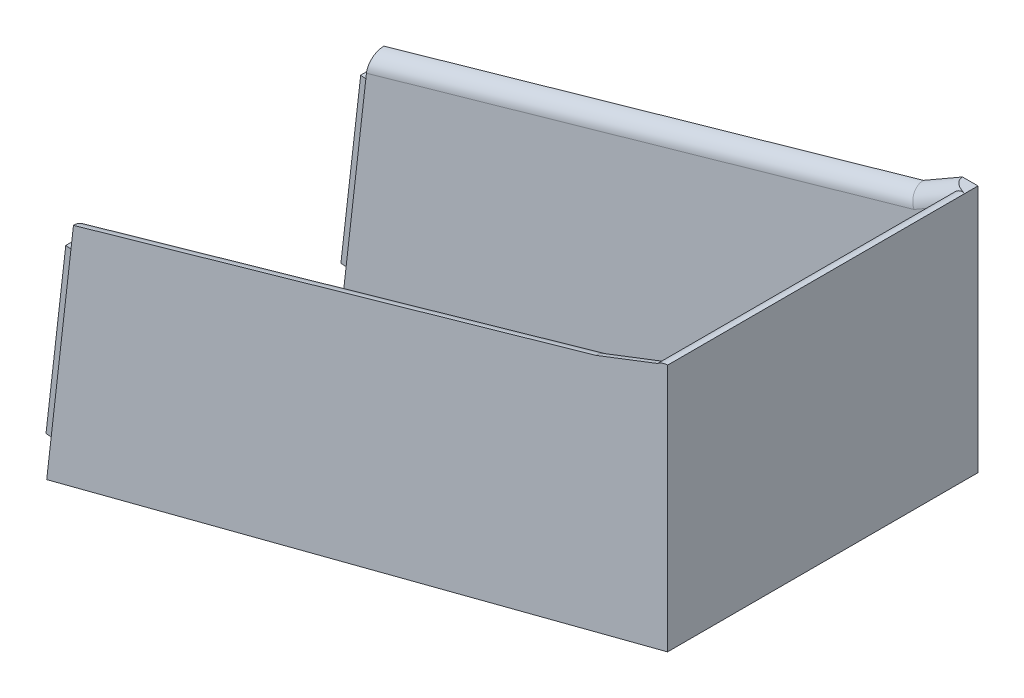
ISO-10303-21;
HEADER;
FILE_DESCRIPTION(('STEP AP214'),'2;1');
FILE_NAME('part.step','',(''),(''),'','','');
FILE_SCHEMA(('AUTOMOTIVE_DESIGN { 1 0 10303 214 1 1 1 1 }'));
ENDSEC;
DATA;
#1=APPLICATION_CONTEXT('core data for automotive mechanical design processes');
#2=APPLICATION_PROTOCOL_DEFINITION('international standard','automotive_design',2000,#1);
#3=PRODUCT_CONTEXT('',#1,'mechanical');
#4=PRODUCT('Part','Part','',(#3));
#5=PRODUCT_RELATED_PRODUCT_CATEGORY('part','',(#4));
#6=PRODUCT_DEFINITION_FORMATION('','',#4);
#7=PRODUCT_DEFINITION_CONTEXT('part definition',#1,'design');
#8=PRODUCT_DEFINITION('design','',#6,#7);
#9=PRODUCT_DEFINITION_SHAPE('','',#8);
#10=(LENGTH_UNIT() NAMED_UNIT(*) SI_UNIT(.MILLI.,.METRE.));
#11=(NAMED_UNIT(*) PLANE_ANGLE_UNIT() SI_UNIT($,.RADIAN.));
#12=(NAMED_UNIT(*) SI_UNIT($,.STERADIAN.) SOLID_ANGLE_UNIT());
#13=UNCERTAINTY_MEASURE_WITH_UNIT(LENGTH_MEASURE(1.E-05),#10,'distance_accuracy_value','');
#14=(GEOMETRIC_REPRESENTATION_CONTEXT(3) GLOBAL_UNCERTAINTY_ASSIGNED_CONTEXT((#13)) GLOBAL_UNIT_ASSIGNED_CONTEXT((#10,
#11,#12)) REPRESENTATION_CONTEXT('',''));
#15=CARTESIAN_POINT('',(0.,0.,0.));
#16=DIRECTION('',(0.,0.,1.));
#17=DIRECTION('',(1.,0.,0.));
#18=AXIS2_PLACEMENT_3D('',#15,#16,#17);
#19=CARTESIAN_POINT('',(0.120693948879546,-0.0138211267695866,-60.));
#20=DIRECTION('',(0.993507079917707,-0.113770304356588,0.));
#21=DIRECTION('',(0.113770304356588,0.993507079917707,0.));
#22=AXIS2_PLACEMENT_3D('',#19,#20,#21);
#23=PLANE('',#22);
#24=DIRECTION('',(0.113770304356588,0.993507079917707,0.));
#25=VECTOR('',#24,1.);
#26=CARTESIAN_POINT('',(2.25147391153479,18.5933628006785,48.5));
#27=LINE('',#26,#25);
#28=CARTESIAN_POINT('',(2.25147391153479,18.5933628006785,48.5));
#29=VERTEX_POINT('',#28);
#30=CARTESIAN_POINT('',(8.6226109555037,74.2297592760701,48.5));
#31=VERTEX_POINT('',#30);
#32=EDGE_CURVE('E241',#29,#31,#27,.T.);
#33=ORIENTED_EDGE('',*,*,#32,.F.);
#34=DIRECTION('',(0.,0.,1.));
#35=VECTOR('',#34,1.);
#36=CARTESIAN_POINT('',(2.25147391153479,18.5933628006785,48.5));
#37=LINE('',#36,#35);
#38=CARTESIAN_POINT('',(2.2514739115348,18.5933628006785,46.5));
#39=VERTEX_POINT('',#38);
#40=EDGE_CURVE('E254',#39,#29,#37,.T.);
#41=ORIENTED_EDGE('',*,*,#40,.F.);
#42=DIRECTION('',(-0.113770304356588,-0.993507079917707,0.));
#43=VECTOR('',#42,1.);
#44=CARTESIAN_POINT('',(2.25147391153479,18.5933628006785,46.5));
#45=LINE('',#44,#43);
#46=CARTESIAN_POINT('',(8.6226109555037,74.2297592760701,46.5));
#47=VERTEX_POINT('',#46);
#48=EDGE_CURVE('E263',#47,#39,#45,.T.);
#49=ORIENTED_EDGE('',*,*,#48,.F.);
#50=DIRECTION('',(0.,0.,-1.));
#51=VECTOR('',#50,1.);
#52=CARTESIAN_POINT('',(8.6226109555037,74.2297592760701,48.5));
#53=LINE('',#52,#51);
#54=EDGE_CURVE('E244',#31,#47,#53,.T.);
#55=ORIENTED_EDGE('',*,*,#54,.F.);
#56=EDGE_LOOP('',(#33,#41,#49,#55));
#57=FACE_BOUND('',#56,.T.);
#58=DIRECTION('',(0.113770304356588,0.993507079917707,0.));
#59=VECTOR('',#58,1.);
#60=CARTESIAN_POINT('',(8.82568470144232,76.0031148584115,-45.));
#61=LINE('',#60,#59);
#62=CARTESIAN_POINT('',(1.59011779420309,12.8180245994505,-45.));
#63=VERTEX_POINT('',#62);
#64=CARTESIAN_POINT('',(9.00156900629349,77.5390367591594,-45.));
#65=VERTEX_POINT('',#64);
#66=EDGE_CURVE('E340',#63,#65,#61,.T.);
#67=ORIENTED_EDGE('',*,*,#66,.T.);
#68=CARTESIAN_POINT('',(9.00156900629348,77.5390367591594,-50.));
#69=DIRECTION('',(0.993507079917707,-0.113770304356588,0.));
#70=DIRECTION('',(-0.113770304356588,-0.993507079917707,0.));
#71=AXIS2_PLACEMENT_3D('',#68,#69,#70);
#72=ELLIPSE('',#71,5.40858432939447,5.);
#73=CARTESIAN_POINT('',(9.61690529158696,82.9125035827447,-50.));
#74=VERTEX_POINT('',#73);
#75=EDGE_CURVE('E373',#65,#74,#72,.F.);
#76=ORIENTED_EDGE('',*,*,#75,.T.);
#77=DIRECTION('',(0.113770304356588,0.993507079917707,0.));
#78=VECTOR('',#77,1.);
#79=CARTESIAN_POINT('',(0.120693948879546,-0.0138211267695866,-50.));
#80=LINE('',#79,#78);
#81=CARTESIAN_POINT('',(0.999999999999999,7.66477999979995,-50.));
#82=VERTEX_POINT('',#81);
#83=EDGE_CURVE('E343',#82,#74,#80,.T.);
#84=ORIENTED_EDGE('',*,*,#83,.F.);
#85=DIRECTION('',(0.,0.,-1.));
#86=VECTOR('',#85,1.);
#87=CARTESIAN_POINT('',(0.999999999999999,7.66477999979995,50.));
#88=LINE('',#87,#86);
#89=CARTESIAN_POINT('',(0.999999999999999,7.66477999979995,50.));
#90=VERTEX_POINT('',#89);
#91=EDGE_CURVE('E364',#90,#82,#88,.T.);
#92=ORIENTED_EDGE('',*,*,#91,.F.);
#93=DIRECTION('',(0.113770304356588,0.993507079917707,0.));
#94=VECTOR('',#93,1.);
#95=CARTESIAN_POINT('',(0.120693948879546,-0.0138211267695866,50.));
#96=LINE('',#95,#94);
#97=CARTESIAN_POINT('',(9.61690529158697,82.9125035827448,50.));
#98=VERTEX_POINT('',#97);
#99=EDGE_CURVE('E328',#90,#98,#96,.T.);
#100=ORIENTED_EDGE('',*,*,#99,.T.);
#101=CARTESIAN_POINT('',(9.00156900629348,77.5390367591594,50.));
#102=DIRECTION('',(0.993507079917707,-0.113770304356588,0.));
#103=DIRECTION('',(0.113770304356588,0.993507079917707,0.));
#104=AXIS2_PLACEMENT_3D('',#101,#102,#103);
#105=ELLIPSE('',#104,5.40858432939447,5.);
#106=CARTESIAN_POINT('',(9.00156900629348,77.5390367591594,45.));
#107=VERTEX_POINT('',#106);
#108=EDGE_CURVE('E371',#98,#107,#105,.F.);
#109=ORIENTED_EDGE('',*,*,#108,.T.);
#110=DIRECTION('',(-0.113770304356588,-0.993507079917707,0.));
#111=VECTOR('',#110,1.);
#112=CARTESIAN_POINT('',(8.82568470144232,76.0031148584115,45.));
#113=LINE('',#112,#111);
#114=CARTESIAN_POINT('',(1.59011779420309,12.8180245994506,45.));
#115=VERTEX_POINT('',#114);
#116=EDGE_CURVE('E367',#107,#115,#113,.T.);
#117=ORIENTED_EDGE('',*,*,#116,.T.);
#118=DIRECTION('',(0.,0.,1.));
#119=VECTOR('',#118,1.);
#120=CARTESIAN_POINT('',(1.59011779420309,12.8180245994505,-60.));
#121=LINE('',#120,#119);
#122=EDGE_CURVE('E337',#63,#115,#121,.T.);
#123=ORIENTED_EDGE('',*,*,#122,.F.);
#124=EDGE_LOOP('',(#67,#76,#84,#92,#100,#109,#117,#123));
#125=FACE_BOUND('',#124,.T.);
#126=DIRECTION('',(0.,0.,1.));
#127=VECTOR('',#126,1.);
#128=CARTESIAN_POINT('',(2.25147391153479,18.5933628006785,-48.5));
#129=LINE('',#128,#127);
#130=CARTESIAN_POINT('',(2.25147391153479,18.5933628006785,-48.5));
#131=VERTEX_POINT('',#130);
#132=CARTESIAN_POINT('',(2.25147391153479,18.5933628006785,-46.5));
#133=VERTEX_POINT('',#132);
#134=EDGE_CURVE('E279',#131,#133,#129,.T.);
#135=ORIENTED_EDGE('',*,*,#134,.F.);
#136=DIRECTION('',(-0.113770304356588,-0.993507079917707,0.));
#137=VECTOR('',#136,1.);
#138=CARTESIAN_POINT('',(2.25147391153479,18.5933628006785,-48.5));
#139=LINE('',#138,#137);
#140=CARTESIAN_POINT('',(8.6226109555037,74.2297592760701,-48.5));
#141=VERTEX_POINT('',#140);
#142=EDGE_CURVE('E284',#141,#131,#139,.T.);
#143=ORIENTED_EDGE('',*,*,#142,.F.);
#144=DIRECTION('',(0.,0.,-1.));
#145=VECTOR('',#144,1.);
#146=CARTESIAN_POINT('',(8.6226109555037,74.2297592760701,-48.5));
#147=LINE('',#146,#145);
#148=CARTESIAN_POINT('',(8.6226109555037,74.2297592760701,-46.5));
#149=VERTEX_POINT('',#148);
#150=EDGE_CURVE('E296',#149,#141,#147,.T.);
#151=ORIENTED_EDGE('',*,*,#150,.F.);
#152=DIRECTION('',(0.113770304356588,0.993507079917707,0.));
#153=VECTOR('',#152,1.);
#154=CARTESIAN_POINT('',(2.25147391153479,18.5933628006785,-46.5));
#155=LINE('',#154,#153);
#156=EDGE_CURVE('E293',#133,#149,#155,.T.);
#157=ORIENTED_EDGE('',*,*,#156,.F.);
#158=EDGE_LOOP('',(#135,#143,#151,#157));
#159=FACE_BOUND('',#158,.T.);
#160=DIRECTION('',(-0.113770304356588,-0.993507079917707,0.));
#161=VECTOR('',#160,1.);
#162=CARTESIAN_POINT('',(1.17065602014721,9.15504554146032,-19.));
#163=LINE('',#162,#161);
#164=CARTESIAN_POINT('',(1.39819662886039,11.1420597012957,-19.));
#165=VERTEX_POINT('',#164);
#166=CARTESIAN_POINT('',(1.17065602014721,9.15504554146032,-19.));
#167=VERTEX_POINT('',#166);
#168=EDGE_CURVE('E240',#165,#167,#163,.T.);
#169=ORIENTED_EDGE('',*,*,#168,.F.);
#170=DIRECTION('',(0.,0.,-1.));
#171=VECTOR('',#170,1.);
#172=CARTESIAN_POINT('',(1.39819662886039,11.1420597012957,-19.));
#173=LINE('',#172,#171);
#174=CARTESIAN_POINT('',(1.39819662886039,11.1420597012957,19.));
#175=VERTEX_POINT('',#174);
#176=EDGE_CURVE('E237',#175,#165,#173,.T.);
#177=ORIENTED_EDGE('',*,*,#176,.F.);
#178=DIRECTION('',(0.113770304356587,0.993507079917707,0.));
#179=VECTOR('',#178,1.);
#180=CARTESIAN_POINT('',(1.17065602014721,9.15504554146032,19.));
#181=LINE('',#180,#179);
#182=CARTESIAN_POINT('',(1.17065602014721,9.15504554146032,19.));
#183=VERTEX_POINT('',#182);
#184=EDGE_CURVE('E819',#183,#175,#181,.T.);
#185=ORIENTED_EDGE('',*,*,#184,.F.);
#186=DIRECTION('',(0.,0.,1.));
#187=VECTOR('',#186,1.);
#188=CARTESIAN_POINT('',(1.17065602014721,9.15504554146032,-19.));
#189=LINE('',#188,#187);
#190=EDGE_CURVE('E814',#167,#183,#189,.T.);
#191=ORIENTED_EDGE('',*,*,#190,.F.);
#192=EDGE_LOOP('',(#169,#177,#185,#191));
#193=FACE_BOUND('',#192,.T.);
#194=ADVANCED_FACE('F35',(#57,#125,#159,#193),#23,.F.);
#195=CARTESIAN_POINT('',(116.,125.181970091956,0.));
#196=DIRECTION('',(0.,0.,1.));
#197=DIRECTION('',(1.,0.,0.));
#198=AXIS2_PLACEMENT_3D('',#195,#196,#197);
#199=CYLINDRICAL_SURFACE('',#198,80.);
#200=DIRECTION('',(0.,0.,1.));
#201=VECTOR('',#200,1.);
#202=CARTESIAN_POINT('',(196.,125.181970091956,0.));
#203=LINE('',#202,#201);
#204=CARTESIAN_POINT('',(196.,125.181970091956,-45.));
#205=VERTEX_POINT('',#204);
#206=CARTESIAN_POINT('',(196.,125.181970091956,45.));
#207=VERTEX_POINT('',#206);
#208=EDGE_CURVE('E381',#205,#207,#203,.T.);
#209=ORIENTED_EDGE('',*,*,#208,.F.);
#210=CARTESIAN_POINT('',(116.,125.181970091956,-45.));
#211=DIRECTION('',(0.,0.,1.));
#212=DIRECTION('',(1.,0.,0.));
#213=AXIS2_PLACEMENT_3D('',#210,#211,#212);
#214=CIRCLE('',#213,80.);
#215=CARTESIAN_POINT('',(136.107843518532,47.7502283510252,-45.));
#216=VERTEX_POINT('',#215);
#217=EDGE_CURVE('E387',#216,#205,#214,.T.);
#218=ORIENTED_EDGE('',*,*,#217,.F.);
#219=DIRECTION('',(0.,0.,1.));
#220=VECTOR('',#219,1.);
#221=CARTESIAN_POINT('',(136.107843518532,47.7502283510252,-60.));
#222=LINE('',#221,#220);
#223=CARTESIAN_POINT('',(136.107843518532,47.7502283510252,45.));
#224=VERTEX_POINT('',#223);
#225=EDGE_CURVE('E384',#224,#216,#222,.F.);
#226=ORIENTED_EDGE('',*,*,#225,.F.);
#227=CARTESIAN_POINT('',(116.,125.181970091956,45.));
#228=DIRECTION('',(0.,0.,-1.));
#229=DIRECTION('',(-1.,0.,0.));
#230=AXIS2_PLACEMENT_3D('',#227,#228,#229);
#231=CIRCLE('',#230,80.);
#232=EDGE_CURVE('E390',#207,#224,#231,.T.);
#233=ORIENTED_EDGE('',*,*,#232,.F.);
#234=EDGE_LOOP('',(#209,#218,#226,#233));
#235=FACE_BOUND('',#234,.T.);
#236=ADVANCED_FACE('F423',(#235),#199,.F.);
#237=CARTESIAN_POINT('',(196.,-2.73205331442692E-13,0.));
#238=DIRECTION('',(-1.,0.,0.));
#239=DIRECTION('',(0.,-1.,0.));
#240=AXIS2_PLACEMENT_3D('',#237,#238,#239);
#241=PLANE('',#240);
#242=CARTESIAN_POINT('',(196.,132.410787947716,50.));
#243=DIRECTION('',(-1.,0.,0.));
#244=DIRECTION('',(0.,-1.,0.));
#245=AXIS2_PLACEMENT_3D('',#242,#243,#244);
#246=ELLIPSE('',#245,5.35904728054362,5.);
#247=CARTESIAN_POINT('',(196.,132.410787947716,45.));
#248=VERTEX_POINT('',#247);
#249=CARTESIAN_POINT('',(196.,134.601732640766,45.4369494627883));
#250=VERTEX_POINT('',#249);
#251=EDGE_CURVE('E402',#248,#250,#246,.F.);
#252=ORIENTED_EDGE('',*,*,#251,.T.);
#253=DIRECTION('',(0.,0.,1.));
#254=VECTOR('',#253,1.);
#255=CARTESIAN_POINT('',(196.,134.601732640766,0.));
#256=LINE('',#255,#254);
#257=CARTESIAN_POINT('',(196.,134.601732640766,-45.0445919696959));
#258=VERTEX_POINT('',#257);
#259=EDGE_CURVE('E411',#250,#258,#256,.F.);
#260=ORIENTED_EDGE('',*,*,#259,.T.);
#261=CARTESIAN_POINT('',(196.,133.833014406096,-50.));
#262=DIRECTION('',(-1.,0.,0.));
#263=DIRECTION('',(0.,1.,0.));
#264=AXIS2_PLACEMENT_3D('',#261,#262,#263);
#265=ELLIPSE('',#264,5.76871823467044,5.);
#266=CARTESIAN_POINT('',(196.,133.833014406096,-45.));
#267=VERTEX_POINT('',#266);
#268=EDGE_CURVE('E397',#258,#267,#265,.F.);
#269=ORIENTED_EDGE('',*,*,#268,.T.);
#270=DIRECTION('',(0.,-1.,0.));
#271=VECTOR('',#270,1.);
#272=CARTESIAN_POINT('',(196.,79.3741669578156,-45.));
#273=LINE('',#272,#271);
#274=EDGE_CURVE('E326',#267,#205,#273,.T.);
#275=ORIENTED_EDGE('',*,*,#274,.T.);
#276=ORIENTED_EDGE('',*,*,#208,.T.);
#277=DIRECTION('',(0.,1.,0.));
#278=VECTOR('',#277,1.);
#279=CARTESIAN_POINT('',(196.,79.3741669578156,45.));
#280=LINE('',#279,#278);
#281=EDGE_CURVE('E323',#207,#248,#280,.T.);
#282=ORIENTED_EDGE('',*,*,#281,.T.);
#283=EDGE_LOOP('',(#252,#260,#269,#275,#276,#282));
#284=FACE_BOUND('',#283,.T.);
#285=ADVANCED_FACE('F426',(#284),#241,.T.);
#286=CARTESIAN_POINT('',(-1.80150387051405,6.93727213056809,50.));
#287=DIRECTION('',(0.251348043981642,-0.967896771761639,0.));
#288=DIRECTION('',(0.967896771761639,0.251348043981642,0.));
#289=AXIS2_PLACEMENT_3D('',#286,#287,#288);
#290=PLANE('',#289);
#291=DIRECTION('',(-0.967896771761639,-0.251348043981642,0.));
#292=VECTOR('',#291,1.);
#293=CARTESIAN_POINT('',(-1.80150387051405,6.93727213056809,-50.));
#294=LINE('',#293,#292);
#295=CARTESIAN_POINT('',(201.,59.6017326407662,-50.));
#296=VERTEX_POINT('',#295);
#297=EDGE_CURVE('E351',#296,#82,#294,.T.);
#298=ORIENTED_EDGE('',*,*,#297,.F.);
#299=DIRECTION('',(0.,0.,-1.));
#300=VECTOR('',#299,1.);
#301=CARTESIAN_POINT('',(201.,59.6017326407662,50.));
#302=LINE('',#301,#300);
#303=CARTESIAN_POINT('',(201.,59.6017326407662,50.));
#304=VERTEX_POINT('',#303);
#305=EDGE_CURVE('E358',#304,#296,#302,.T.);
#306=ORIENTED_EDGE('',*,*,#305,.F.);
#307=DIRECTION('',(-0.967896771761639,-0.251348043981642,0.));
#308=VECTOR('',#307,1.);
#309=CARTESIAN_POINT('',(-1.80150387051405,6.93727213056809,50.));
#310=LINE('',#309,#308);
#311=EDGE_CURVE('E352',#304,#90,#310,.T.);
#312=ORIENTED_EDGE('',*,*,#311,.T.);
#313=ORIENTED_EDGE('',*,*,#91,.T.);
#314=EDGE_LOOP('',(#298,#306,#312,#313));
#315=FACE_BOUND('',#314,.T.);
#316=ADVANCED_FACE('F438',(#315),#290,.T.);
#317=CARTESIAN_POINT('',(201.,0.,50.));
#318=DIRECTION('',(1.,0.,0.));
#319=DIRECTION('',(0.,0.,-1.));
#320=AXIS2_PLACEMENT_3D('',#317,#318,#319);
#321=PLANE('',#320);
#322=DIRECTION('',(0.,-1.,0.));
#323=VECTOR('',#322,1.);
#324=CARTESIAN_POINT('',(201.,0.,-50.));
#325=LINE('',#324,#323);
#326=CARTESIAN_POINT('',(201.,139.601732640766,-50.));
#327=VERTEX_POINT('',#326);
#328=EDGE_CURVE('E356',#327,#296,#325,.T.);
#329=ORIENTED_EDGE('',*,*,#328,.F.);
#330=DIRECTION('',(0.,0.,1.));
#331=VECTOR('',#330,1.);
#332=CARTESIAN_POINT('',(201.,139.601732640766,50.));
#333=LINE('',#332,#331);
#334=CARTESIAN_POINT('',(201.,139.601732640766,-45.6734762540364));
#335=VERTEX_POINT('',#334);
#336=EDGE_CURVE('E317',#327,#335,#333,.T.);
#337=ORIENTED_EDGE('',*,*,#336,.T.);
#338=CARTESIAN_POINT('',(201.,139.601732640766,50.));
#339=VERTEX_POINT('',#338);
#340=EDGE_CURVE('E316',#335,#339,#333,.T.);
#341=ORIENTED_EDGE('',*,*,#340,.T.);
#342=DIRECTION('',(0.,-1.,0.));
#343=VECTOR('',#342,1.);
#344=CARTESIAN_POINT('',(201.,0.,50.));
#345=LINE('',#344,#343);
#346=EDGE_CURVE('E355',#339,#304,#345,.T.);
#347=ORIENTED_EDGE('',*,*,#346,.T.);
#348=ORIENTED_EDGE('',*,*,#305,.T.);
#349=EDGE_LOOP('',(#329,#337,#341,#347,#348));
#350=FACE_BOUND('',#349,.T.);
#351=ADVANCED_FACE('F441',(#350),#321,.T.);
#352=CARTESIAN_POINT('',(0.,0.,50.));
#353=DIRECTION('',(0.,0.,1.));
#354=DIRECTION('',(1.,0.,0.));
#355=AXIS2_PLACEMENT_3D('',#352,#353,#354);
#356=PLANE('',#355);
#357=CARTESIAN_POINT('',(201.,134.601732640766,50.));
#358=DIRECTION('',(0.,0.,1.));
#359=DIRECTION('',(1.,0.,0.));
#360=AXIS2_PLACEMENT_3D('',#357,#358,#359);
#361=CIRCLE('',#360,5.);
#362=CARTESIAN_POINT('',(197.846945722077,138.482228578204,50.));
#363=VERTEX_POINT('',#362);
#364=EDGE_CURVE('E408',#339,#363,#361,.T.);
#365=ORIENTED_EDGE('',*,*,#364,.T.);
#366=DIRECTION('',(0.93300165836432,0.359872068226235,0.));
#367=VECTOR('',#366,1.);
#368=CARTESIAN_POINT('',(-20.8742207463868,54.1183500832254,50.));
#369=LINE('',#368,#367);
#370=CARTESIAN_POINT('',(177.897772484686,130.787547472353,50.));
#371=VERTEX_POINT('',#370);
#372=EDGE_CURVE('E314',#371,#363,#369,.T.);
#373=ORIENTED_EDGE('',*,*,#372,.F.);
#374=DIRECTION('',(0.961833151413441,0.273636599968074,0.));
#375=VECTOR('',#374,1.);
#376=CARTESIAN_POINT('',(-21.1018851898423,74.1731651952943,50.));
#377=LINE('',#376,#375);
#378=CARTESIAN_POINT('',(9.97370373156668,83.0140109095056,50.));
#379=VERTEX_POINT('',#378);
#380=EDGE_CURVE('E331',#379,#371,#377,.T.);
#381=ORIENTED_EDGE('',*,*,#380,.F.);
#382=DIRECTION('',(0.961833151413441,0.273636599968074,0.));
#383=VECTOR('',#382,1.);
#384=CARTESIAN_POINT('',(-21.1018851898423,74.1731651952943,50.));
#385=LINE('',#384,#383);
#386=EDGE_CURVE('E377',#379,#98,#385,.F.);
#387=ORIENTED_EDGE('',*,*,#386,.T.);
#388=ORIENTED_EDGE('',*,*,#99,.F.);
#389=ORIENTED_EDGE('',*,*,#311,.F.);
#390=ORIENTED_EDGE('',*,*,#346,.F.);
#391=EDGE_LOOP('',(#365,#373,#381,#387,#388,#389,#390));
#392=FACE_BOUND('',#391,.T.);
#393=ADVANCED_FACE('F445',(#392),#356,.T.);
#394=CARTESIAN_POINT('',(0.,0.,-50.));
#395=DIRECTION('',(0.,0.,1.));
#396=DIRECTION('',(1.,0.,0.));
#397=AXIS2_PLACEMENT_3D('',#394,#395,#396);
#398=PLANE('',#397);
#399=ORIENTED_EDGE('',*,*,#83,.T.);
#400=DIRECTION('',(-0.961833151413441,-0.273636599968074,0.));
#401=VECTOR('',#400,1.);
#402=CARTESIAN_POINT('',(-21.1018851898423,74.1731651952943,-50.));
#403=LINE('',#402,#401);
#404=CARTESIAN_POINT('',(9.97370373156668,83.0140109095056,-50.));
#405=VERTEX_POINT('',#404);
#406=EDGE_CURVE('E375',#74,#405,#403,.F.);
#407=ORIENTED_EDGE('',*,*,#406,.T.);
#408=DIRECTION('',(0.961833151413441,0.273636599968074,0.));
#409=VECTOR('',#408,1.);
#410=CARTESIAN_POINT('',(-21.1018851898423,74.1731651952943,-50.));
#411=LINE('',#410,#409);
#412=CARTESIAN_POINT('',(183.405636921285,132.354506664081,-50.));
#413=VERTEX_POINT('',#412);
#414=EDGE_CURVE('E334',#405,#413,#411,.T.);
#415=ORIENTED_EDGE('',*,*,#414,.T.);
#416=DIRECTION('',(-0.866743667587996,-0.498753861835786,0.));
#417=VECTOR('',#416,1.);
#418=CARTESIAN_POINT('',(-11.5926162256729,20.1458624648966,-50.));
#419=LINE('',#418,#417);
#420=CARTESIAN_POINT('',(196.,139.601732640766,-50.));
#421=VERTEX_POINT('',#420);
#422=EDGE_CURVE('E312',#421,#413,#419,.T.);
#423=ORIENTED_EDGE('',*,*,#422,.F.);
#424=DIRECTION('',(1.,0.,0.));
#425=VECTOR('',#424,1.);
#426=CARTESIAN_POINT('',(196.,139.601732640766,-50.));
#427=LINE('',#426,#425);
#428=EDGE_CURVE('E320',#421,#327,#427,.T.);
#429=ORIENTED_EDGE('',*,*,#428,.T.);
#430=ORIENTED_EDGE('',*,*,#328,.T.);
#431=ORIENTED_EDGE('',*,*,#297,.T.);
#432=EDGE_LOOP('',(#399,#407,#415,#423,#429,#430,#431));
#433=FACE_BOUND('',#432,.T.);
#434=ADVANCED_FACE('F447',(#433),#398,.F.);
#435=CARTESIAN_POINT('',(-3.01789867230622,11.6213929345011,-60.));
#436=DIRECTION('',(0.251348043981642,-0.967896771761639,0.));
#437=DIRECTION('',(0.967896771761639,0.251348043981642,0.));
#438=AXIS2_PLACEMENT_3D('',#435,#436,#437);
#439=PLANE('',#438);
#440=DIRECTION('',(0.967896771761639,0.251348043981642,0.));
#441=VECTOR('',#440,1.);
#442=CARTESIAN_POINT('',(-3.01789867230622,11.6213929345011,45.));
#443=LINE('',#442,#441);
#444=EDGE_CURVE('E346',#115,#224,#443,.T.);
#445=ORIENTED_EDGE('',*,*,#444,.T.);
#446=ORIENTED_EDGE('',*,*,#225,.T.);
#447=DIRECTION('',(-0.967896771761639,-0.251348043981642,0.));
#448=VECTOR('',#447,1.);
#449=CARTESIAN_POINT('',(-3.01789867230623,11.6213929345011,-45.));
#450=LINE('',#449,#448);
#451=EDGE_CURVE('E349',#216,#63,#450,.T.);
#452=ORIENTED_EDGE('',*,*,#451,.T.);
#453=ORIENTED_EDGE('',*,*,#122,.T.);
#454=EDGE_LOOP('',(#445,#446,#452,#453));
#455=FACE_BOUND('',#454,.T.);
#456=ADVANCED_FACE('F450',(#455),#439,.F.);
#457=CARTESIAN_POINT('',(-20.6122617510212,79.3741669578159,-45.));
#458=DIRECTION('',(0.,0.,1.));
#459=DIRECTION('',(1.,0.,0.));
#460=AXIS2_PLACEMENT_3D('',#457,#458,#459);
#461=PLANE('',#460);
#462=ORIENTED_EDGE('',*,*,#274,.F.);
#463=DIRECTION('',(-0.866743667587996,-0.498753861835786,0.));
#464=VECTOR('',#463,1.);
#465=CARTESIAN_POINT('',(168.031733785644,117.739120323108,-45.));
#466=LINE('',#465,#464);
#467=CARTESIAN_POINT('',(185.365879393743,127.713778791306,-45.));
#468=VERTEX_POINT('',#467);
#469=EDGE_CURVE('E392',#267,#468,#466,.T.);
#470=ORIENTED_EDGE('',*,*,#469,.T.);
#471=DIRECTION('',(0.961833151413441,0.273636599968074,0.));
#472=VECTOR('',#471,1.);
#473=CARTESIAN_POINT('',(-19.7337021900019,69.3639994382271,-45.));
#474=LINE('',#473,#472);
#475=EDGE_CURVE('E369',#468,#65,#474,.F.);
#476=ORIENTED_EDGE('',*,*,#475,.T.);
#477=ORIENTED_EDGE('',*,*,#66,.F.);
#478=ORIENTED_EDGE('',*,*,#451,.F.);
#479=ORIENTED_EDGE('',*,*,#217,.T.);
#480=EDGE_LOOP('',(#462,#470,#476,#477,#478,#479));
#481=FACE_BOUND('',#480,.T.);
#482=ADVANCED_FACE('F457',(#481),#461,.T.);
#483=CARTESIAN_POINT('',(-20.6122617510212,79.3741669578159,45.));
#484=DIRECTION('',(0.,0.,-1.));
#485=DIRECTION('',(-1.,0.,0.));
#486=AXIS2_PLACEMENT_3D('',#483,#484,#485);
#487=PLANE('',#486);
#488=DIRECTION('',(-0.961833151413441,-0.273636599968074,0.));
#489=VECTOR('',#488,1.);
#490=CARTESIAN_POINT('',(-19.7337021900019,69.3639994382271,45.));
#491=LINE('',#490,#489);
#492=CARTESIAN_POINT('',(179.484824516725,126.040648832739,45.));
#493=VERTEX_POINT('',#492);
#494=EDGE_CURVE('E379',#107,#493,#491,.F.);
#495=ORIENTED_EDGE('',*,*,#494,.T.);
#496=DIRECTION('',(0.93300165836432,0.359872068226235,0.));
#497=VECTOR('',#496,1.);
#498=CARTESIAN_POINT('',(197.799360341131,133.104826936438,45.));
#499=LINE('',#498,#497);
#500=EDGE_CURVE('E399',#493,#248,#499,.T.);
#501=ORIENTED_EDGE('',*,*,#500,.T.);
#502=ORIENTED_EDGE('',*,*,#281,.F.);
#503=ORIENTED_EDGE('',*,*,#232,.T.);
#504=ORIENTED_EDGE('',*,*,#444,.F.);
#505=ORIENTED_EDGE('',*,*,#116,.F.);
#506=EDGE_LOOP('',(#495,#501,#502,#503,#504,#505));
#507=FACE_BOUND('',#506,.T.);
#508=ADVANCED_FACE('F461',(#507),#487,.T.);
#509=CARTESIAN_POINT('',(196.,139.601732640766,50.));
#510=DIRECTION('',(0.,1.,0.));
#511=DIRECTION('',(-1.,0.,0.));
#512=AXIS2_PLACEMENT_3D('',#509,#510,#511);
#513=PLANE('',#512);
#514=ORIENTED_EDGE('',*,*,#428,.F.);
#515=CARTESIAN_POINT('',(206.02498503289,139.601732640766,-50.));
#516=DIRECTION('',(0.,1.,0.));
#517=DIRECTION('',(1.,0.,0.));
#518=AXIS2_PLACEMENT_3D('',#515,#516,#517);
#519=ELLIPSE('',#518,10.0249850328903,5.);
#520=EDGE_CURVE('E55',#421,#335,#519,.T.);
#521=ORIENTED_EDGE('',*,*,#520,.T.);
#522=ORIENTED_EDGE('',*,*,#336,.F.);
#523=EDGE_LOOP('',(#514,#521,#522));
#524=FACE_BOUND('',#523,.T.);
#525=ADVANCED_FACE('F436',(#524),#513,.T.);
#526=CARTESIAN_POINT('',(-19.7337021900019,69.3639994382271,-50.));
#527=DIRECTION('',(-0.961833151413441,-0.273636599968074,0.));
#528=DIRECTION('',(0.273636599968074,-0.961833151413441,0.));
#529=AXIS2_PLACEMENT_3D('',#526,#527,#528);
#530=CYLINDRICAL_SURFACE('',#529,5.);
#531=ORIENTED_EDGE('',*,*,#75,.F.);
#532=ORIENTED_EDGE('',*,*,#475,.F.);
#533=CARTESIAN_POINT('',(185.365879393743,127.713778791306,-50.));
#534=DIRECTION('',(0.921190936312911,0.389110856768277,0.));
#535=DIRECTION('',(-0.389110856768277,0.921190936312911,0.));
#536=AXIS2_PLACEMENT_3D('',#533,#534,#535);
#537=ELLIPSE('',#536,5.03774808222693,5.);
#538=EDGE_CURVE('E395',#468,#413,#537,.F.);
#539=ORIENTED_EDGE('',*,*,#538,.T.);
#540=ORIENTED_EDGE('',*,*,#414,.F.);
#541=ORIENTED_EDGE('',*,*,#406,.F.);
#542=EDGE_LOOP('',(#531,#532,#539,#540,#541));
#543=FACE_BOUND('',#542,.T.);
#544=ADVANCED_FACE('F432',(#543),#530,.T.);
#545=CARTESIAN_POINT('',(-19.7337021900019,69.3639994382271,50.));
#546=DIRECTION('',(0.961833151413441,0.273636599968074,0.));
#547=DIRECTION('',(-0.273636599968074,0.961833151413441,0.));
#548=AXIS2_PLACEMENT_3D('',#545,#546,#547);
#549=CYLINDRICAL_SURFACE('',#548,5.);
#550=ORIENTED_EDGE('',*,*,#108,.F.);
#551=ORIENTED_EDGE('',*,*,#386,.F.);
#552=ORIENTED_EDGE('',*,*,#380,.T.);
#553=CARTESIAN_POINT('',(179.484824516725,126.040648832738,50.));
#554=DIRECTION('',(-0.948398058877604,-0.317082200568232,0.));
#555=DIRECTION('',(0.317082200568231,-0.948398058877605,0.));
#556=AXIS2_PLACEMENT_3D('',#553,#554,#555);
#557=ELLIPSE('',#556,5.00517540623416,5.);
#558=EDGE_CURVE('E404',#371,#493,#557,.T.);
#559=ORIENTED_EDGE('',*,*,#558,.T.);
#560=ORIENTED_EDGE('',*,*,#494,.F.);
#561=EDGE_LOOP('',(#550,#551,#552,#559,#560));
#562=FACE_BOUND('',#561,.T.);
#563=ADVANCED_FACE('F428',(#562),#549,.T.);
#564=CARTESIAN_POINT('',(-0.729047328218327,18.9346737137483,-48.5));
#565=DIRECTION('',(0.113770304356588,0.993507079917707,0.));
#566=DIRECTION('',(-0.993507079917707,0.113770304356588,0.));
#567=AXIS2_PLACEMENT_3D('',#564,#565,#566);
#568=PLANE('',#567);
#569=ORIENTED_EDGE('',*,*,#134,.T.);
#570=DIRECTION('',(0.993507079917707,-0.113770304356588,0.));
#571=VECTOR('',#570,1.);
#572=CARTESIAN_POINT('',(-0.729047328218327,18.9346737137483,-46.5));
#573=LINE('',#572,#571);
#574=CARTESIAN_POINT('',(-0.729047328218327,18.9346737137483,-46.5));
#575=VERTEX_POINT('',#574);
#576=EDGE_CURVE('E309',#575,#133,#573,.T.);
#577=ORIENTED_EDGE('',*,*,#576,.F.);
#578=DIRECTION('',(0.,0.,1.));
#579=VECTOR('',#578,1.);
#580=CARTESIAN_POINT('',(-0.729047328218327,18.9346737137483,-48.5));
#581=LINE('',#580,#579);
#582=CARTESIAN_POINT('',(-0.729047328218327,18.9346737137483,-48.5));
#583=VERTEX_POINT('',#582);
#584=EDGE_CURVE('E280',#583,#575,#581,.T.);
#585=ORIENTED_EDGE('',*,*,#584,.F.);
#586=DIRECTION('',(0.993507079917707,-0.113770304356588,0.));
#587=VECTOR('',#586,1.);
#588=CARTESIAN_POINT('',(-0.729047328218327,18.9346737137483,-48.5));
#589=LINE('',#588,#587);
#590=EDGE_CURVE('E290',#583,#131,#589,.T.);
#591=ORIENTED_EDGE('',*,*,#590,.T.);
#592=EDGE_LOOP('',(#569,#577,#585,#591));
#593=FACE_BOUND('',#592,.T.);
#594=ADVANCED_FACE('F431',(#593),#568,.F.);
#595=CARTESIAN_POINT('',(-0.729047328218327,18.9346737137483,-46.5));
#596=DIRECTION('',(0.,0.,-1.));
#597=DIRECTION('',(-1.,0.,0.));
#598=AXIS2_PLACEMENT_3D('',#595,#596,#597);
#599=PLANE('',#598);
#600=ORIENTED_EDGE('',*,*,#156,.T.);
#601=DIRECTION('',(0.993507079917707,-0.113770304356588,0.));
#602=VECTOR('',#601,1.);
#603=CARTESIAN_POINT('',(5.64208971575058,74.5710701891399,-46.5));
#604=LINE('',#603,#602);
#605=CARTESIAN_POINT('',(5.64208971575058,74.5710701891399,-46.5));
#606=VERTEX_POINT('',#605);
#607=EDGE_CURVE('E306',#606,#149,#604,.T.);
#608=ORIENTED_EDGE('',*,*,#607,.F.);
#609=DIRECTION('',(0.113770304356588,0.993507079917707,0.));
#610=VECTOR('',#609,1.);
#611=CARTESIAN_POINT('',(-0.729047328218327,18.9346737137483,-46.5));
#612=LINE('',#611,#610);
#613=EDGE_CURVE('E283',#575,#606,#612,.T.);
#614=ORIENTED_EDGE('',*,*,#613,.F.);
#615=ORIENTED_EDGE('',*,*,#576,.T.);
#616=EDGE_LOOP('',(#600,#608,#614,#615));
#617=FACE_BOUND('',#616,.T.);
#618=ADVANCED_FACE('F477',(#617),#599,.F.);
#619=CARTESIAN_POINT('',(5.64208971575058,74.5710701891399,-48.5));
#620=DIRECTION('',(-0.113770304356588,-0.993507079917707,0.));
#621=DIRECTION('',(0.993507079917707,-0.113770304356588,0.));
#622=AXIS2_PLACEMENT_3D('',#619,#620,#621);
#623=PLANE('',#622);
#624=ORIENTED_EDGE('',*,*,#150,.T.);
#625=DIRECTION('',(0.993507079917707,-0.113770304356588,0.));
#626=VECTOR('',#625,1.);
#627=CARTESIAN_POINT('',(5.64208971575058,74.5710701891399,-48.5));
#628=LINE('',#627,#626);
#629=CARTESIAN_POINT('',(5.64208971575058,74.5710701891399,-48.5));
#630=VERTEX_POINT('',#629);
#631=EDGE_CURVE('E303',#630,#141,#628,.T.);
#632=ORIENTED_EDGE('',*,*,#631,.F.);
#633=DIRECTION('',(0.,0.,-1.));
#634=VECTOR('',#633,1.);
#635=CARTESIAN_POINT('',(5.64208971575058,74.5710701891399,-48.5));
#636=LINE('',#635,#634);
#637=EDGE_CURVE('E286',#606,#630,#636,.T.);
#638=ORIENTED_EDGE('',*,*,#637,.F.);
#639=ORIENTED_EDGE('',*,*,#607,.T.);
#640=EDGE_LOOP('',(#624,#632,#638,#639));
#641=FACE_BOUND('',#640,.T.);
#642=ADVANCED_FACE('F481',(#641),#623,.F.);
#643=CARTESIAN_POINT('',(-0.729047328218327,18.9346737137483,-48.5));
#644=DIRECTION('',(0.,0.,1.));
#645=DIRECTION('',(1.,0.,0.));
#646=AXIS2_PLACEMENT_3D('',#643,#644,#645);
#647=PLANE('',#646);
#648=ORIENTED_EDGE('',*,*,#142,.T.);
#649=ORIENTED_EDGE('',*,*,#590,.F.);
#650=DIRECTION('',(-0.113770304356588,-0.993507079917707,0.));
#651=VECTOR('',#650,1.);
#652=CARTESIAN_POINT('',(-0.729047328218327,18.9346737137483,-48.5));
#653=LINE('',#652,#651);
#654=EDGE_CURVE('E288',#630,#583,#653,.T.);
#655=ORIENTED_EDGE('',*,*,#654,.F.);
#656=ORIENTED_EDGE('',*,*,#631,.T.);
#657=EDGE_LOOP('',(#648,#649,#655,#656));
#658=FACE_BOUND('',#657,.T.);
#659=ADVANCED_FACE('F485',(#658),#647,.F.);
#660=CARTESIAN_POINT('',(-2.85982729087358,0.327489786300176,0.));
#661=DIRECTION('',(-0.993507079917707,0.113770304356588,0.));
#662=DIRECTION('',(-0.113770304356588,-0.993507079917707,0.));
#663=AXIS2_PLACEMENT_3D('',#660,#661,#662);
#664=PLANE('',#663);
#665=ORIENTED_EDGE('',*,*,#584,.T.);
#666=ORIENTED_EDGE('',*,*,#613,.T.);
#667=ORIENTED_EDGE('',*,*,#637,.T.);
#668=ORIENTED_EDGE('',*,*,#654,.T.);
#669=EDGE_LOOP('',(#665,#666,#667,#668));
#670=FACE_BOUND('',#669,.T.);
#671=ADVANCED_FACE('F489',(#670),#664,.T.);
#672=CARTESIAN_POINT('',(-0.729047328218327,18.9346737137483,48.5));
#673=DIRECTION('',(0.,0.,-1.));
#674=DIRECTION('',(-1.,0.,0.));
#675=AXIS2_PLACEMENT_3D('',#672,#673,#674);
#676=PLANE('',#675);
#677=ORIENTED_EDGE('',*,*,#32,.T.);
#678=DIRECTION('',(0.993507079917707,-0.113770304356588,0.));
#679=VECTOR('',#678,1.);
#680=CARTESIAN_POINT('',(5.64208971575058,74.5710701891399,48.5));
#681=LINE('',#680,#679);
#682=CARTESIAN_POINT('',(5.64208971575058,74.5710701891399,48.5));
#683=VERTEX_POINT('',#682);
#684=EDGE_CURVE('E276',#683,#31,#681,.T.);
#685=ORIENTED_EDGE('',*,*,#684,.F.);
#686=DIRECTION('',(0.113770304356588,0.993507079917707,0.));
#687=VECTOR('',#686,1.);
#688=CARTESIAN_POINT('',(-0.729047328218327,18.9346737137483,48.5));
#689=LINE('',#688,#687);
#690=CARTESIAN_POINT('',(-0.729047328218327,18.9346737137483,48.5));
#691=VERTEX_POINT('',#690);
#692=EDGE_CURVE('E250',#691,#683,#689,.T.);
#693=ORIENTED_EDGE('',*,*,#692,.F.);
#694=DIRECTION('',(0.993507079917707,-0.113770304356588,0.));
#695=VECTOR('',#694,1.);
#696=CARTESIAN_POINT('',(-0.729047328218327,18.9346737137483,48.5));
#697=LINE('',#696,#695);
#698=EDGE_CURVE('E259',#691,#29,#697,.T.);
#699=ORIENTED_EDGE('',*,*,#698,.T.);
#700=EDGE_LOOP('',(#677,#685,#693,#699));
#701=FACE_BOUND('',#700,.T.);
#702=ADVANCED_FACE('F493',(#701),#676,.F.);
#703=CARTESIAN_POINT('',(5.64208971575058,74.5710701891399,48.5));
#704=DIRECTION('',(-0.113770304356588,-0.993507079917707,0.));
#705=DIRECTION('',(0.993507079917707,-0.113770304356588,0.));
#706=AXIS2_PLACEMENT_3D('',#703,#704,#705);
#707=PLANE('',#706);
#708=ORIENTED_EDGE('',*,*,#54,.T.);
#709=DIRECTION('',(0.993507079917707,-0.113770304356588,0.));
#710=VECTOR('',#709,1.);
#711=CARTESIAN_POINT('',(5.64208971575058,74.5710701891399,46.5));
#712=LINE('',#711,#710);
#713=CARTESIAN_POINT('',(5.64208971575058,74.5710701891399,46.5));
#714=VERTEX_POINT('',#713);
#715=EDGE_CURVE('E273',#714,#47,#712,.T.);
#716=ORIENTED_EDGE('',*,*,#715,.F.);
#717=DIRECTION('',(0.,0.,-1.));
#718=VECTOR('',#717,1.);
#719=CARTESIAN_POINT('',(5.64208971575058,74.5710701891399,48.5));
#720=LINE('',#719,#718);
#721=EDGE_CURVE('E253',#683,#714,#720,.T.);
#722=ORIENTED_EDGE('',*,*,#721,.F.);
#723=ORIENTED_EDGE('',*,*,#684,.T.);
#724=EDGE_LOOP('',(#708,#716,#722,#723));
#725=FACE_BOUND('',#724,.T.);
#726=ADVANCED_FACE('F497',(#725),#707,.F.);
#727=CARTESIAN_POINT('',(-0.729047328218327,18.9346737137483,46.5));
#728=DIRECTION('',(0.,0.,1.));
#729=DIRECTION('',(1.,0.,0.));
#730=AXIS2_PLACEMENT_3D('',#727,#728,#729);
#731=PLANE('',#730);
#732=ORIENTED_EDGE('',*,*,#48,.T.);
#733=DIRECTION('',(0.993507079917707,-0.113770304356588,0.));
#734=VECTOR('',#733,1.);
#735=CARTESIAN_POINT('',(-0.729047328218327,18.9346737137483,46.5));
#736=LINE('',#735,#734);
#737=CARTESIAN_POINT('',(-0.729047328218327,18.9346737137483,46.5));
#738=VERTEX_POINT('',#737);
#739=EDGE_CURVE('E270',#738,#39,#736,.T.);
#740=ORIENTED_EDGE('',*,*,#739,.F.);
#741=DIRECTION('',(-0.113770304356588,-0.993507079917707,0.));
#742=VECTOR('',#741,1.);
#743=CARTESIAN_POINT('',(-0.729047328218327,18.9346737137483,46.5));
#744=LINE('',#743,#742);
#745=EDGE_CURVE('E256',#714,#738,#744,.T.);
#746=ORIENTED_EDGE('',*,*,#745,.F.);
#747=ORIENTED_EDGE('',*,*,#715,.T.);
#748=EDGE_LOOP('',(#732,#740,#746,#747));
#749=FACE_BOUND('',#748,.T.);
#750=ADVANCED_FACE('F501',(#749),#731,.F.);
#751=CARTESIAN_POINT('',(-0.729047328218327,18.9346737137483,48.5));
#752=DIRECTION('',(0.113770304356588,0.993507079917707,0.));
#753=DIRECTION('',(-0.993507079917707,0.113770304356588,0.));
#754=AXIS2_PLACEMENT_3D('',#751,#752,#753);
#755=PLANE('',#754);
#756=ORIENTED_EDGE('',*,*,#40,.T.);
#757=ORIENTED_EDGE('',*,*,#698,.F.);
#758=DIRECTION('',(0.,0.,1.));
#759=VECTOR('',#758,1.);
#760=CARTESIAN_POINT('',(-0.729047328218327,18.9346737137483,48.5));
#761=LINE('',#760,#759);
#762=EDGE_CURVE('E258',#738,#691,#761,.T.);
#763=ORIENTED_EDGE('',*,*,#762,.F.);
#764=ORIENTED_EDGE('',*,*,#739,.T.);
#765=EDGE_LOOP('',(#756,#757,#763,#764));
#766=FACE_BOUND('',#765,.T.);
#767=ADVANCED_FACE('F505',(#766),#755,.F.);
#768=CARTESIAN_POINT('',(-2.85982729087358,0.327489786300176,0.));
#769=DIRECTION('',(-0.993507079917707,0.113770304356588,0.));
#770=DIRECTION('',(-0.113770304356588,-0.993507079917707,0.));
#771=AXIS2_PLACEMENT_3D('',#768,#769,#770);
#772=PLANE('',#771);
#773=ORIENTED_EDGE('',*,*,#692,.T.);
#774=ORIENTED_EDGE('',*,*,#721,.T.);
#775=ORIENTED_EDGE('',*,*,#745,.T.);
#776=ORIENTED_EDGE('',*,*,#762,.T.);
#777=EDGE_LOOP('',(#773,#774,#775,#776));
#778=FACE_BOUND('',#777,.T.);
#779=ADVANCED_FACE('F509',(#778),#772,.T.);
#780=CARTESIAN_POINT('',(-1.80986521960591,9.49635645453009,-19.));
#781=DIRECTION('',(0.,0.,1.));
#782=DIRECTION('',(0.,-1.,0.));
#783=AXIS2_PLACEMENT_3D('',#780,#781,#782);
#784=PLANE('',#783);
#785=ORIENTED_EDGE('',*,*,#168,.T.);
#786=DIRECTION('',(0.993507079917707,-0.113770304356588,0.));
#787=VECTOR('',#786,1.);
#788=CARTESIAN_POINT('',(-1.80986521960591,9.49635645453009,-19.));
#789=LINE('',#788,#787);
#790=CARTESIAN_POINT('',(-1.80986521960591,9.49635645453009,-19.));
#791=VERTEX_POINT('',#790);
#792=EDGE_CURVE('E221',#791,#167,#789,.T.);
#793=ORIENTED_EDGE('',*,*,#792,.F.);
#794=DIRECTION('',(-0.113770304356588,-0.993507079917707,0.));
#795=VECTOR('',#794,1.);
#796=CARTESIAN_POINT('',(-1.80986521960591,9.49635645453009,-19.));
#797=LINE('',#796,#795);
#798=CARTESIAN_POINT('',(-1.58232461089273,11.4833706143655,-19.));
#799=VERTEX_POINT('',#798);
#800=EDGE_CURVE('E228',#799,#791,#797,.T.);
#801=ORIENTED_EDGE('',*,*,#800,.F.);
#802=DIRECTION('',(0.993507079917707,-0.113770304356588,0.));
#803=VECTOR('',#802,1.);
#804=CARTESIAN_POINT('',(-1.58232461089273,11.4833706143655,-19.));
#805=LINE('',#804,#803);
#806=EDGE_CURVE('E817',#799,#165,#805,.T.);
#807=ORIENTED_EDGE('',*,*,#806,.T.);
#808=EDGE_LOOP('',(#785,#793,#801,#807));
#809=FACE_BOUND('',#808,.T.);
#810=ADVANCED_FACE('F239',(#809),#784,.F.);
#811=CARTESIAN_POINT('',(-1.80986521960591,9.49635645453009,-19.));
#812=DIRECTION('',(0.113770304356588,0.993507079917707,0.));
#813=DIRECTION('',(-0.993507079917707,0.113770304356588,0.));
#814=AXIS2_PLACEMENT_3D('',#811,#812,#813);
#815=PLANE('',#814);
#816=ORIENTED_EDGE('',*,*,#190,.T.);
#817=DIRECTION('',(0.993507079917707,-0.113770304356588,0.));
#818=VECTOR('',#817,1.);
#819=CARTESIAN_POINT('',(-1.80986521960591,9.49635645453009,19.));
#820=LINE('',#819,#818);
#821=CARTESIAN_POINT('',(-1.80986521960591,9.49635645453009,19.));
#822=VERTEX_POINT('',#821);
#823=EDGE_CURVE('E224',#822,#183,#820,.T.);
#824=ORIENTED_EDGE('',*,*,#823,.F.);
#825=DIRECTION('',(0.,0.,1.));
#826=VECTOR('',#825,1.);
#827=CARTESIAN_POINT('',(-1.80986521960591,9.49635645453009,-19.));
#828=LINE('',#827,#826);
#829=EDGE_CURVE('E216',#791,#822,#828,.T.);
#830=ORIENTED_EDGE('',*,*,#829,.F.);
#831=ORIENTED_EDGE('',*,*,#792,.T.);
#832=EDGE_LOOP('',(#816,#824,#830,#831));
#833=FACE_BOUND('',#832,.T.);
#834=ADVANCED_FACE('F219',(#833),#815,.F.);
#835=CARTESIAN_POINT('',(-1.80986521960591,9.49635645453009,19.));
#836=DIRECTION('',(0.,0.,-1.));
#837=DIRECTION('',(0.,1.,0.));
#838=AXIS2_PLACEMENT_3D('',#835,#836,#837);
#839=PLANE('',#838);
#840=ORIENTED_EDGE('',*,*,#184,.T.);
#841=DIRECTION('',(0.993507079917707,-0.113770304356588,0.));
#842=VECTOR('',#841,1.);
#843=CARTESIAN_POINT('',(-1.58232461089273,11.4833706143655,19.));
#844=LINE('',#843,#842);
#845=CARTESIAN_POINT('',(-1.58232461089273,11.4833706143655,19.));
#846=VERTEX_POINT('',#845);
#847=EDGE_CURVE('E246',#846,#175,#844,.T.);
#848=ORIENTED_EDGE('',*,*,#847,.F.);
#849=DIRECTION('',(0.113770304356587,0.993507079917707,0.));
#850=VECTOR('',#849,1.);
#851=CARTESIAN_POINT('',(-1.80986521960591,9.49635645453009,19.));
#852=LINE('',#851,#850);
#853=EDGE_CURVE('E227',#822,#846,#852,.T.);
#854=ORIENTED_EDGE('',*,*,#853,.F.);
#855=ORIENTED_EDGE('',*,*,#823,.T.);
#856=EDGE_LOOP('',(#840,#848,#854,#855));
#857=FACE_BOUND('',#856,.T.);
#858=ADVANCED_FACE('F518',(#857),#839,.F.);
#859=CARTESIAN_POINT('',(-1.58232461089273,11.4833706143655,-19.));
#860=DIRECTION('',(-0.113770304356588,-0.993507079917707,0.));
#861=DIRECTION('',(0.993507079917707,-0.113770304356588,0.));
#862=AXIS2_PLACEMENT_3D('',#859,#860,#861);
#863=PLANE('',#862);
#864=ORIENTED_EDGE('',*,*,#176,.T.);
#865=ORIENTED_EDGE('',*,*,#806,.F.);
#866=DIRECTION('',(0.,0.,-1.));
#867=VECTOR('',#866,1.);
#868=CARTESIAN_POINT('',(-1.58232461089273,11.4833706143655,-19.));
#869=LINE('',#868,#867);
#870=EDGE_CURVE('E233',#846,#799,#869,.T.);
#871=ORIENTED_EDGE('',*,*,#870,.F.);
#872=ORIENTED_EDGE('',*,*,#847,.T.);
#873=EDGE_LOOP('',(#864,#865,#871,#872));
#874=FACE_BOUND('',#873,.T.);
#875=ADVANCED_FACE('F521',(#874),#863,.F.);
#876=CARTESIAN_POINT('',(-2.85982729087358,0.327489786300176,0.));
#877=DIRECTION('',(0.993507079917707,-0.113770304356588,0.));
#878=DIRECTION('',(0.113770304356588,0.993507079917707,0.));
#879=AXIS2_PLACEMENT_3D('',#876,#877,#878);
#880=PLANE('',#879);
#881=ORIENTED_EDGE('',*,*,#800,.T.);
#882=ORIENTED_EDGE('',*,*,#829,.T.);
#883=ORIENTED_EDGE('',*,*,#853,.T.);
#884=ORIENTED_EDGE('',*,*,#870,.T.);
#885=EDGE_LOOP('',(#881,#882,#883,#884));
#886=FACE_BOUND('',#885,.T.);
#887=ADVANCED_FACE('F231',(#886),#880,.F.);
#888=CARTESIAN_POINT('',(9.72910070477368,26.6463872113986,-50.));
#889=DIRECTION('',(0.866743667587996,0.498753861835786,0.));
#890=DIRECTION('',(-0.498753861835786,0.866743667587996,0.));
#891=AXIS2_PLACEMENT_3D('',#888,#889,#890);
#892=CYLINDRICAL_SURFACE('',#891,5.);
#893=ORIENTED_EDGE('',*,*,#268,.F.);
#894=CARTESIAN_POINT('',(196.,134.601732640766,-45.0445919696959));
#895=CARTESIAN_POINT('',(195.999984225125,134.740831450542,-45.0607904212304));
#896=CARTESIAN_POINT('',(196.005803032552,134.879362927842,-45.0810354727157));
#897=CARTESIAN_POINT('',(196.028706883743,135.154167140735,-45.1281744833023));
#898=CARTESIAN_POINT('',(196.045776621019,135.290442687593,-45.1550593781047));
#899=CARTESIAN_POINT('',(196.090682594939,135.55940146481,-45.2139557445376));
#900=CARTESIAN_POINT('',(196.118471187942,135.692097850037,-45.2459441679334));
#901=CARTESIAN_POINT('',(196.184419407264,135.953921257529,-45.3137444691478));
#902=CARTESIAN_POINT('',(196.222582598665,136.083047035971,-45.3495576587194));
#903=CARTESIAN_POINT('',(196.308709726404,136.336561182865,-45.4234269545332));
#904=CARTESIAN_POINT('',(196.356624520776,136.460969733195,-45.4614711590975));
#905=CARTESIAN_POINT('',(196.462067774382,136.705270943024,-45.5385525322513));
#906=CARTESIAN_POINT('',(196.51959570133,136.825163852107,-45.5775896457611));
#907=CARTESIAN_POINT('',(196.706477411956,137.177882743777,-45.6941970046329));
#908=CARTESIAN_POINT('',(196.850071566899,137.403580079282,-45.7712106453926));
#909=CARTESIAN_POINT('',(197.155365276859,137.807210173985,-45.9030491970519));
#910=CARTESIAN_POINT('',(197.313057194192,137.987648807604,-45.9594096006675));
#911=CARTESIAN_POINT('',(197.569839771661,138.241579579903,-46.0287022581911));
#912=CARTESIAN_POINT('',(197.658749838159,138.323392088996,-46.0492508724696));
#913=CARTESIAN_POINT('',(197.842951735686,138.48087035992,-46.0842702484042));
#914=CARTESIAN_POINT('',(197.938240571086,138.556538970639,-46.0987438401424));
#915=CARTESIAN_POINT('',(198.135394199784,138.701626558199,-46.1208846530717));
#916=CARTESIAN_POINT('',(198.237304757611,138.770991790272,-46.1284975313111));
#917=CARTESIAN_POINT('',(198.44618713243,138.902109936632,-46.1362520826034));
#918=CARTESIAN_POINT('',(198.553158923978,138.963862889182,-46.1363937932111));
#919=CARTESIAN_POINT('',(198.771269460258,139.079230782191,-46.1291905138979));
#920=CARTESIAN_POINT('',(198.882411431579,139.132839252076,-46.1218396066643));
#921=CARTESIAN_POINT('',(199.107736686951,139.231471399185,-46.1001118414244));
#922=CARTESIAN_POINT('',(199.221919905476,139.276495261196,-46.0857351346752));
#923=CARTESIAN_POINT('',(199.543268930732,139.389803250215,-46.0369642138176));
#924=CARTESIAN_POINT('',(199.75284427854,139.448481464545,-45.9957221021873));
#925=CARTESIAN_POINT('',(200.174548637721,139.537841262593,-45.8997034966631));
#926=CARTESIAN_POINT('',(200.386676577526,139.568534205689,-45.8449325057001));
#927=CARTESIAN_POINT('',(200.665734678793,139.590998860689,-45.7684316005074));
#928=CARTESIAN_POINT('',(200.732691124758,139.59503189119,-45.74973914032));
#929=CARTESIAN_POINT('',(200.866440361555,139.600395383158,-45.711905820753));
#930=CARTESIAN_POINT('',(200.933233210818,139.601731260643,-45.6927659382042));
#931=CARTESIAN_POINT('',(201.,139.601732640766,-45.6734762540364));
#932=B_SPLINE_CURVE_WITH_KNOTS('',3,(#894,#895,#896,#897,#898,#899,#900,#901,#902,#903,#904,
#905,#906,#907,#908,#909,#910,#911,#912,#913,#914,#915,#916,#917,#918,#919,#920,#921,#922,#923,
#924,#925,#926,#927,#928,#929,#930,#931),.UNSPECIFIED.,.F.,.F.,(4,2,2,2,2,2,2,2,2,2,2,2,2,2,2,2,
2,2,4),(0.,0.419798590727969,0.839027236034263,1.25641355747097,1.6739434894356,
2.08941923534369,2.50487198365315,3.33632965763831,4.0717396681401,4.43901282215769,
4.80611468958311,5.17609940499871,5.54608226063326,5.91635753767926,6.28662484349343,
6.94848963339449,7.61008564894871,7.81895082988949,8.02739618026971),.UNSPECIFIED.);
#933=EDGE_CURVE('E11',#258,#335,#932,.T.);
#934=ORIENTED_EDGE('',*,*,#933,.T.);
#935=ORIENTED_EDGE('',*,*,#520,.F.);
#936=ORIENTED_EDGE('',*,*,#422,.T.);
#937=ORIENTED_EDGE('',*,*,#538,.F.);
#938=ORIENTED_EDGE('',*,*,#469,.F.);
#939=EDGE_LOOP('',(#893,#934,#935,#936,#937,#938));
#940=FACE_BOUND('',#939,.T.);
#941=ADVANCED_FACE('F419',(#940),#892,.T.);
#942=CARTESIAN_POINT('',(-10.3669028692337,52.8121254124408,50.));
#943=DIRECTION('',(-0.93300165836432,-0.359872068226235,0.));
#944=DIRECTION('',(0.359872068226235,-0.93300165836432,0.));
#945=AXIS2_PLACEMENT_3D('',#942,#943,#944);
#946=CYLINDRICAL_SURFACE('',#945,5.);
#947=ORIENTED_EDGE('',*,*,#558,.F.);
#948=ORIENTED_EDGE('',*,*,#372,.T.);
#949=CARTESIAN_POINT('',(197.846945722077,138.482228578204,50.));
#950=CARTESIAN_POINT('',(197.846986483395,138.482252195648,49.9477441496225));
#951=CARTESIAN_POINT('',(197.844887494045,138.480556455239,49.8955374205151));
#952=CARTESIAN_POINT('',(197.836762331795,138.473937853323,49.7917727280022));
#953=CARTESIAN_POINT('',(197.830746730862,138.469023679005,49.7402133978764));
#954=CARTESIAN_POINT('',(197.807633800804,138.450002781603,49.588879632558));
#955=CARTESIAN_POINT('',(197.785442650519,138.431600460299,49.4904062082511));
#956=CARTESIAN_POINT('',(197.736426245586,138.389860841,49.3157127100942));
#957=CARTESIAN_POINT('',(197.711135993483,138.367991467403,49.238658774025));
#958=CARTESIAN_POINT('',(197.656236200179,138.319339686891,49.0876683143614));
#959=CARTESIAN_POINT('',(197.626623468431,138.29255364705,49.0137341459763));
#960=CARTESIAN_POINT('',(197.533032327587,138.205531301683,48.7944041134219));
#961=CARTESIAN_POINT('',(197.464890624668,138.139109542867,48.6532839166347));
#962=CARTESIAN_POINT('',(197.315179926648,137.983377641639,48.3590949888379));
#963=CARTESIAN_POINT('',(197.233114918797,137.892135570553,48.2073429968032));
#964=CARTESIAN_POINT('',(197.07041458076,137.696025626665,47.9118786483893));
#965=CARTESIAN_POINT('',(196.989780766739,137.591144181999,47.7681745065514));
#966=CARTESIAN_POINT('',(196.833549117132,137.369235709341,47.4883106415734));
#967=CARTESIAN_POINT('',(196.757938543838,137.252241489646,47.3521319957956));
#968=CARTESIAN_POINT('',(196.613945128551,137.006479337652,47.0868909672773));
#969=CARTESIAN_POINT('',(196.545557901333,136.877718638276,46.9578242899589));
#970=CARTESIAN_POINT('',(196.43147253282,136.637011638931,46.7336729309748));
#971=CARTESIAN_POINT('',(196.384028694378,136.527231941278,46.6371543505385));
#972=CARTESIAN_POINT('',(196.295925155276,136.300697406158,46.4493921162193));
#973=CARTESIAN_POINT('',(196.255266410762,136.18394158877,46.3581492069586));
#974=CARTESIAN_POINT('',(196.145290235936,135.824180454104,46.0938947509454));
#975=CARTESIAN_POINT('',(196.08751761735,135.570756720344,45.9294877746563));
#976=CARTESIAN_POINT('',(196.033704910961,135.192542774678,45.7173770431104));
#977=CARTESIAN_POINT('',(196.021256050619,135.077088848431,45.6567097001023));
#978=CARTESIAN_POINT('',(196.004398979076,134.842227263181,45.5417961585052));
#979=CARTESIAN_POINT('',(196.000004405027,134.722813246431,45.4875609954978));
#980=CARTESIAN_POINT('',(196.,134.601732640766,45.4369494627883));
#981=B_SPLINE_CURVE_WITH_KNOTS('',3,(#949,#950,#951,#952,#953,#954,#955,#956,#957,#958,#959,
#960,#961,#962,#963,#964,#965,#966,#967,#968,#969,#970,#971,#972,#973,#974,#975,#976,#977,#978,
#979,#980),.UNSPECIFIED.,.F.,.F.,(4,2,2,2,2,2,2,2,2,2,2,2,2,2,2,4),(0.,0.156614064473135,
0.312807129235001,0.619161880596643,0.870813891507143,1.12265260222024,1.63214355206124,
2.21693699408058,2.80231685237141,3.38615070975792,3.96962806479512,4.43027384699966,
4.89098448805921,5.80839587726485,6.20105665917253,6.59438166449526),.UNSPECIFIED.);
#982=EDGE_CURVE('E49',#363,#250,#981,.T.);
#983=ORIENTED_EDGE('',*,*,#982,.T.);
#984=ORIENTED_EDGE('',*,*,#251,.F.);
#985=ORIENTED_EDGE('',*,*,#500,.F.);
#986=EDGE_LOOP('',(#947,#948,#983,#984,#985));
#987=FACE_BOUND('',#986,.T.);
#988=ADVANCED_FACE('F416',(#987),#946,.T.);
#989=CARTESIAN_POINT('',(201.,134.601732640766,50.));
#990=DIRECTION('',(0.,0.,1.));
#991=DIRECTION('',(1.,0.,0.));
#992=AXIS2_PLACEMENT_3D('',#989,#990,#991);
#993=CYLINDRICAL_SURFACE('',#992,5.);
#994=ORIENTED_EDGE('',*,*,#933,.F.);
#995=ORIENTED_EDGE('',*,*,#259,.F.);
#996=ORIENTED_EDGE('',*,*,#982,.F.);
#997=ORIENTED_EDGE('',*,*,#364,.F.);
#998=ORIENTED_EDGE('',*,*,#340,.F.);
#999=EDGE_LOOP('',(#994,#995,#996,#997,#998));
#1000=FACE_BOUND('',#999,.T.);
#1001=ADVANCED_FACE('F37',(#1000),#993,.T.);
#1002=CLOSED_SHELL('',(#194,#236,#285,#316,#351,#393,#434,#456,#482,#508,#525,#544,#563,#594,
#618,#642,#659,#671,#702,#726,#750,#767,#779,#810,#834,#858,#875,#887,#941,#988,#1001));
#1003=MANIFOLD_SOLID_BREP('B2',#1002);
#1004=ADVANCED_BREP_SHAPE_REPRESENTATION('',(#18,#1003),#14);
#1005=SHAPE_DEFINITION_REPRESENTATION(#9,#1004);
ENDSEC;
END-ISO-10303-21;
